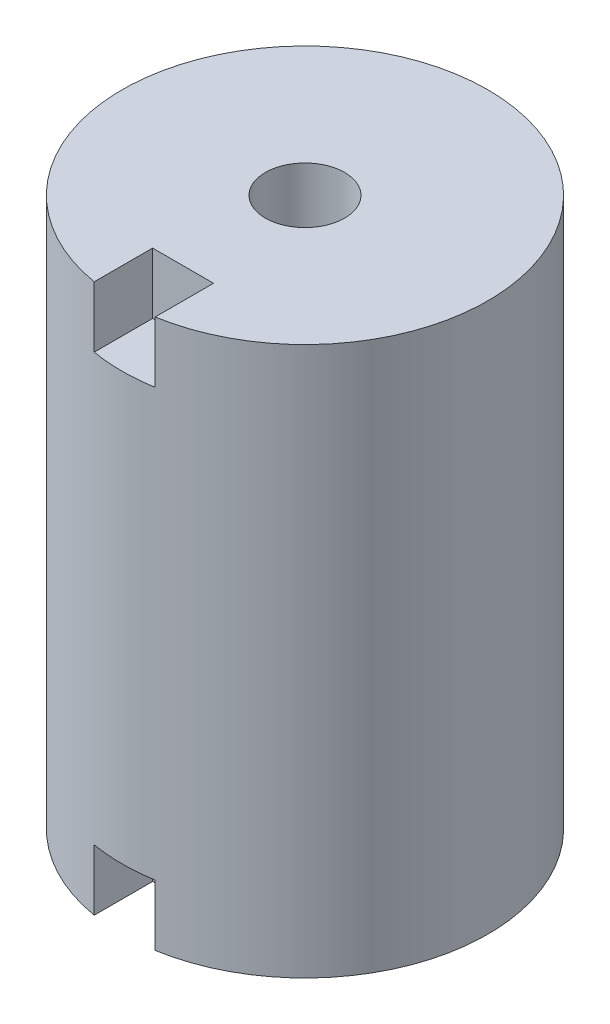
ISO-10303-21;
HEADER;
FILE_DESCRIPTION(('STEP AP214'),'2;1');
FILE_NAME('part.step','',(''),(''),'','','');
FILE_SCHEMA(('AUTOMOTIVE_DESIGN { 1 0 10303 214 1 1 1 1 }'));
ENDSEC;
DATA;
#1=APPLICATION_CONTEXT('core data for automotive mechanical design processes');
#2=APPLICATION_PROTOCOL_DEFINITION('international standard','automotive_design',2000,#1);
#3=PRODUCT_CONTEXT('',#1,'mechanical');
#4=PRODUCT('Part','Part','',(#3));
#5=PRODUCT_RELATED_PRODUCT_CATEGORY('part','',(#4));
#6=PRODUCT_DEFINITION_FORMATION('','',#4);
#7=PRODUCT_DEFINITION_CONTEXT('part definition',#1,'design');
#8=PRODUCT_DEFINITION('design','',#6,#7);
#9=PRODUCT_DEFINITION_SHAPE('','',#8);
#10=(LENGTH_UNIT() NAMED_UNIT(*) SI_UNIT(.MILLI.,.METRE.));
#11=(NAMED_UNIT(*) PLANE_ANGLE_UNIT() SI_UNIT($,.RADIAN.));
#12=(NAMED_UNIT(*) SI_UNIT($,.STERADIAN.) SOLID_ANGLE_UNIT());
#13=UNCERTAINTY_MEASURE_WITH_UNIT(LENGTH_MEASURE(1.E-05),#10,'distance_accuracy_value','');
#14=(GEOMETRIC_REPRESENTATION_CONTEXT(3) GLOBAL_UNCERTAINTY_ASSIGNED_CONTEXT((#13)) GLOBAL_UNIT_ASSIGNED_CONTEXT((#10,
#11,#12)) REPRESENTATION_CONTEXT('',''));
#15=CARTESIAN_POINT('',(0.,0.,0.));
#16=DIRECTION('',(0.,0.,1.));
#17=DIRECTION('',(1.,0.,0.));
#18=AXIS2_PLACEMENT_3D('',#15,#16,#17);
#19=CARTESIAN_POINT('',(0.,-9.,0.));
#20=DIRECTION('',(0.,1.,0.));
#21=DIRECTION('',(0.,0.,1.));
#22=AXIS2_PLACEMENT_3D('',#19,#20,#21);
#23=PLANE('',#22);
#24=DIRECTION('',(-1.,0.,0.));
#25=VECTOR('',#24,1.);
#26=CARTESIAN_POINT('',(-3.10523751104485,-9.,2.6));
#27=LINE('',#26,#25);
#28=CARTESIAN_POINT('',(3.10523751104485,-9.,2.6));
#29=VERTEX_POINT('',#28);
#30=CARTESIAN_POINT('',(-3.10523751104485,-9.,2.6));
#31=VERTEX_POINT('',#30);
#32=EDGE_CURVE('E190',#29,#31,#27,.T.);
#33=ORIENTED_EDGE('',*,*,#32,.F.);
#34=CARTESIAN_POINT('',(0.,-9.,0.));
#35=DIRECTION('',(0.,-1.,0.));
#36=DIRECTION('',(0.,0.,-1.));
#37=AXIS2_PLACEMENT_3D('',#34,#35,#36);
#38=CIRCLE('',#37,4.05);
#39=EDGE_CURVE('E181',#31,#29,#38,.T.);
#40=ORIENTED_EDGE('',*,*,#39,.F.);
#41=EDGE_LOOP('',(#33,#40));
#42=FACE_BOUND('',#41,.T.);
#43=DIRECTION('',(0.,0.,-1.));
#44=VECTOR('',#43,1.);
#45=CARTESIAN_POINT('',(1.,-9.,7.));
#46=LINE('',#45,#44);
#47=CARTESIAN_POINT('',(1.,-9.,5.91607978309962));
#48=VERTEX_POINT('',#47);
#49=CARTESIAN_POINT('',(1.,-9.,4.));
#50=VERTEX_POINT('',#49);
#51=EDGE_CURVE('E144',#48,#50,#46,.T.);
#52=ORIENTED_EDGE('',*,*,#51,.T.);
#53=DIRECTION('',(-1.,0.,0.));
#54=VECTOR('',#53,1.);
#55=CARTESIAN_POINT('',(-1.,-9.,4.));
#56=LINE('',#55,#54);
#57=CARTESIAN_POINT('',(-1.,-9.,4.));
#58=VERTEX_POINT('',#57);
#59=EDGE_CURVE('E148',#50,#58,#56,.T.);
#60=ORIENTED_EDGE('',*,*,#59,.T.);
#61=DIRECTION('',(0.,0.,1.));
#62=VECTOR('',#61,1.);
#63=CARTESIAN_POINT('',(-1.,-9.,7.));
#64=LINE('',#63,#62);
#65=CARTESIAN_POINT('',(-1.,-9.,5.91607978309962));
#66=VERTEX_POINT('',#65);
#67=EDGE_CURVE('E136',#58,#66,#64,.T.);
#68=ORIENTED_EDGE('',*,*,#67,.T.);
#69=CARTESIAN_POINT('',(0.,-9.,0.));
#70=DIRECTION('',(0.,1.,0.));
#71=DIRECTION('',(0.,0.,1.));
#72=AXIS2_PLACEMENT_3D('',#69,#70,#71);
#73=CIRCLE('',#72,6.);
#74=EDGE_CURVE('E211',#48,#66,#73,.T.);
#75=ORIENTED_EDGE('',*,*,#74,.F.);
#76=EDGE_LOOP('',(#52,#60,#68,#75));
#77=FACE_BOUND('',#76,.T.);
#78=ADVANCED_FACE('F43',(#42,#77),#23,.F.);
#79=CARTESIAN_POINT('',(0.,9.,0.));
#80=DIRECTION('',(0.,-1.,0.));
#81=DIRECTION('',(0.,0.,-1.));
#82=AXIS2_PLACEMENT_3D('',#79,#80,#81);
#83=CYLINDRICAL_SURFACE('',#82,6.);
#84=CARTESIAN_POINT('',(0.,7.,0.));
#85=DIRECTION('',(0.,1.,0.));
#86=DIRECTION('',(0.,0.,1.));
#87=AXIS2_PLACEMENT_3D('',#84,#85,#86);
#88=CIRCLE('',#87,6.);
#89=CARTESIAN_POINT('',(-1.,7.,5.91607978309962));
#90=VERTEX_POINT('',#89);
#91=CARTESIAN_POINT('',(1.,7.,5.91607978309962));
#92=VERTEX_POINT('',#91);
#93=EDGE_CURVE('E216',#90,#92,#88,.T.);
#94=ORIENTED_EDGE('',*,*,#93,.F.);
#95=DIRECTION('',(0.,-1.,0.));
#96=VECTOR('',#95,1.);
#97=CARTESIAN_POINT('',(-1.,9.,5.91607978309962));
#98=LINE('',#97,#96);
#99=CARTESIAN_POINT('',(-1.,9.,5.91607978309962));
#100=VERTEX_POINT('',#99);
#101=EDGE_CURVE('E229',#90,#100,#98,.F.);
#102=ORIENTED_EDGE('',*,*,#101,.T.);
#103=CARTESIAN_POINT('',(0.,9.,0.));
#104=DIRECTION('',(0.,1.,0.));
#105=DIRECTION('',(0.,0.,1.));
#106=AXIS2_PLACEMENT_3D('',#103,#104,#105);
#107=CIRCLE('',#106,6.);
#108=CARTESIAN_POINT('',(1.,9.,5.91607978309962));
#109=VERTEX_POINT('',#108);
#110=EDGE_CURVE('E212',#109,#100,#107,.T.);
#111=ORIENTED_EDGE('',*,*,#110,.F.);
#112=DIRECTION('',(0.,-1.,0.));
#113=VECTOR('',#112,1.);
#114=CARTESIAN_POINT('',(1.,9.,5.91607978309962));
#115=LINE('',#114,#113);
#116=EDGE_CURVE('E225',#109,#92,#115,.T.);
#117=ORIENTED_EDGE('',*,*,#116,.T.);
#118=EDGE_LOOP('',(#94,#102,#111,#117));
#119=FACE_BOUND('',#118,.T.);
#120=DIRECTION('',(0.,-1.,0.));
#121=VECTOR('',#120,1.);
#122=CARTESIAN_POINT('',(1.,9.,5.91607978309962));
#123=LINE('',#122,#121);
#124=CARTESIAN_POINT('',(1.,-7.,5.91607978309962));
#125=VERTEX_POINT('',#124);
#126=EDGE_CURVE('E11',#48,#125,#123,.F.);
#127=ORIENTED_EDGE('',*,*,#126,.F.);
#128=ORIENTED_EDGE('',*,*,#74,.T.);
#129=DIRECTION('',(0.,-1.,0.));
#130=VECTOR('',#129,1.);
#131=CARTESIAN_POINT('',(-1.,9.,5.91607978309962));
#132=LINE('',#131,#130);
#133=CARTESIAN_POINT('',(-1.,-7.,5.91607978309962));
#134=VERTEX_POINT('',#133);
#135=EDGE_CURVE('E52',#134,#66,#132,.T.);
#136=ORIENTED_EDGE('',*,*,#135,.F.);
#137=CARTESIAN_POINT('',(0.,-7.,0.));
#138=DIRECTION('',(0.,-1.,0.));
#139=DIRECTION('',(0.,0.,-1.));
#140=AXIS2_PLACEMENT_3D('',#137,#138,#139);
#141=CIRCLE('',#140,6.);
#142=EDGE_CURVE('E142',#125,#134,#141,.T.);
#143=ORIENTED_EDGE('',*,*,#142,.F.);
#144=EDGE_LOOP('',(#127,#128,#136,#143));
#145=FACE_BOUND('',#144,.T.);
#146=ADVANCED_FACE('F45',(#119,#145),#83,.T.);
#147=CARTESIAN_POINT('',(0.,9.,0.));
#148=DIRECTION('',(0.,-1.,0.));
#149=DIRECTION('',(0.,0.,-1.));
#150=AXIS2_PLACEMENT_3D('',#147,#148,#149);
#151=CYLINDRICAL_SURFACE('',#150,1.3);
#152=CARTESIAN_POINT('',(0.,9.,0.));
#153=DIRECTION('',(0.,1.,0.));
#154=DIRECTION('',(0.,0.,1.));
#155=AXIS2_PLACEMENT_3D('',#152,#153,#154);
#156=CIRCLE('',#155,1.3);
#157=CARTESIAN_POINT('',(0.,9.,1.3));
#158=VERTEX_POINT('',#157);
#159=EDGE_CURVE('E207',#158,#158,#156,.T.);
#160=ORIENTED_EDGE('',*,*,#159,.T.);
#161=EDGE_LOOP('',(#160));
#162=FACE_BOUND('',#161,.T.);
#163=CARTESIAN_POINT('',(0.,-3.,0.));
#164=DIRECTION('',(0.,-1.,0.));
#165=DIRECTION('',(0.,0.,-1.));
#166=AXIS2_PLACEMENT_3D('',#163,#164,#165);
#167=CIRCLE('',#166,1.3);
#168=CARTESIAN_POINT('',(0.,-3.,-1.3));
#169=VERTEX_POINT('',#168);
#170=EDGE_CURVE('E203',#169,#169,#167,.T.);
#171=ORIENTED_EDGE('',*,*,#170,.T.);
#172=EDGE_LOOP('',(#171));
#173=FACE_BOUND('',#172,.T.);
#174=ADVANCED_FACE('F259',(#162,#173),#151,.F.);
#175=CARTESIAN_POINT('',(0.,9.,0.));
#176=DIRECTION('',(0.,1.,0.));
#177=DIRECTION('',(0.,0.,1.));
#178=AXIS2_PLACEMENT_3D('',#175,#176,#177);
#179=PLANE('',#178);
#180=DIRECTION('',(0.,0.,1.));
#181=VECTOR('',#180,1.);
#182=CARTESIAN_POINT('',(-1.,9.,7.));
#183=LINE('',#182,#181);
#184=CARTESIAN_POINT('',(-1.,9.,4.));
#185=VERTEX_POINT('',#184);
#186=EDGE_CURVE('E164',#185,#100,#183,.T.);
#187=ORIENTED_EDGE('',*,*,#186,.F.);
#188=DIRECTION('',(-1.,0.,0.));
#189=VECTOR('',#188,1.);
#190=CARTESIAN_POINT('',(-1.,9.,4.));
#191=LINE('',#190,#189);
#192=CARTESIAN_POINT('',(1.,9.,4.));
#193=VERTEX_POINT('',#192);
#194=EDGE_CURVE('E172',#193,#185,#191,.T.);
#195=ORIENTED_EDGE('',*,*,#194,.F.);
#196=DIRECTION('',(0.,0.,-1.));
#197=VECTOR('',#196,1.);
#198=CARTESIAN_POINT('',(1.,9.,7.));
#199=LINE('',#198,#197);
#200=EDGE_CURVE('E158',#109,#193,#199,.T.);
#201=ORIENTED_EDGE('',*,*,#200,.F.);
#202=ORIENTED_EDGE('',*,*,#110,.T.);
#203=EDGE_LOOP('',(#187,#195,#201,#202));
#204=FACE_BOUND('',#203,.T.);
#205=ORIENTED_EDGE('',*,*,#159,.F.);
#206=EDGE_LOOP('',(#205));
#207=FACE_BOUND('',#206,.T.);
#208=ADVANCED_FACE('F263',(#204,#207),#179,.T.);
#209=CARTESIAN_POINT('',(0.,-3.,0.));
#210=DIRECTION('',(0.,-1.,0.));
#211=DIRECTION('',(0.,0.,-1.));
#212=AXIS2_PLACEMENT_3D('',#209,#210,#211);
#213=CYLINDRICAL_SURFACE('',#212,4.05);
#214=ORIENTED_EDGE('',*,*,#39,.T.);
#215=DIRECTION('',(0.,-1.,0.));
#216=VECTOR('',#215,1.);
#217=CARTESIAN_POINT('',(3.10523751104485,-3.,2.6));
#218=LINE('',#217,#216);
#219=CARTESIAN_POINT('',(3.10523751104485,-3.,2.6));
#220=VERTEX_POINT('',#219);
#221=EDGE_CURVE('E194',#220,#29,#218,.T.);
#222=ORIENTED_EDGE('',*,*,#221,.F.);
#223=CARTESIAN_POINT('',(0.,-3.,0.));
#224=DIRECTION('',(0.,-1.,0.));
#225=DIRECTION('',(0.,0.,-1.));
#226=AXIS2_PLACEMENT_3D('',#223,#224,#225);
#227=CIRCLE('',#226,4.05);
#228=CARTESIAN_POINT('',(-3.10523751104485,-3.,2.6));
#229=VERTEX_POINT('',#228);
#230=EDGE_CURVE('E185',#229,#220,#227,.T.);
#231=ORIENTED_EDGE('',*,*,#230,.F.);
#232=DIRECTION('',(0.,-1.,0.));
#233=VECTOR('',#232,1.);
#234=CARTESIAN_POINT('',(-3.10523751104485,-3.,2.6));
#235=LINE('',#234,#233);
#236=EDGE_CURVE('E200',#229,#31,#235,.T.);
#237=ORIENTED_EDGE('',*,*,#236,.T.);
#238=EDGE_LOOP('',(#214,#222,#231,#237));
#239=FACE_BOUND('',#238,.T.);
#240=ADVANCED_FACE('F266',(#239),#213,.F.);
#241=CARTESIAN_POINT('',(-3.10523751104485,-3.,2.6));
#242=DIRECTION('',(0.,0.,1.));
#243=DIRECTION('',(1.,0.,0.));
#244=AXIS2_PLACEMENT_3D('',#241,#242,#243);
#245=PLANE('',#244);
#246=ORIENTED_EDGE('',*,*,#32,.T.);
#247=ORIENTED_EDGE('',*,*,#236,.F.);
#248=DIRECTION('',(-1.,0.,0.));
#249=VECTOR('',#248,1.);
#250=CARTESIAN_POINT('',(-3.10523751104485,-3.,2.6));
#251=LINE('',#250,#249);
#252=EDGE_CURVE('E189',#220,#229,#251,.T.);
#253=ORIENTED_EDGE('',*,*,#252,.F.);
#254=ORIENTED_EDGE('',*,*,#221,.T.);
#255=EDGE_LOOP('',(#246,#247,#253,#254));
#256=FACE_BOUND('',#255,.T.);
#257=ADVANCED_FACE('F273',(#256),#245,.F.);
#258=CARTESIAN_POINT('',(0.,-3.,0.));
#259=DIRECTION('',(0.,-1.,0.));
#260=DIRECTION('',(0.,0.,-1.));
#261=AXIS2_PLACEMENT_3D('',#258,#259,#260);
#262=PLANE('',#261);
#263=ORIENTED_EDGE('',*,*,#170,.F.);
#264=EDGE_LOOP('',(#263));
#265=FACE_BOUND('',#264,.T.);
#266=ORIENTED_EDGE('',*,*,#230,.T.);
#267=ORIENTED_EDGE('',*,*,#252,.T.);
#268=EDGE_LOOP('',(#266,#267));
#269=FACE_BOUND('',#268,.T.);
#270=ADVANCED_FACE('F277',(#265,#269),#262,.T.);
#271=CARTESIAN_POINT('',(-1.,7.,7.));
#272=DIRECTION('',(-1.,0.,0.));
#273=DIRECTION('',(0.,0.,1.));
#274=AXIS2_PLACEMENT_3D('',#271,#272,#273);
#275=PLANE('',#274);
#276=DIRECTION('',(0.,0.,1.));
#277=VECTOR('',#276,1.);
#278=CARTESIAN_POINT('',(-1.,7.,7.));
#279=LINE('',#278,#277);
#280=CARTESIAN_POINT('',(-1.,7.,4.));
#281=VERTEX_POINT('',#280);
#282=EDGE_CURVE('E66',#281,#90,#279,.T.);
#283=ORIENTED_EDGE('',*,*,#282,.F.);
#284=DIRECTION('',(0.,1.,0.));
#285=VECTOR('',#284,1.);
#286=CARTESIAN_POINT('',(-1.,7.,4.));
#287=LINE('',#286,#285);
#288=EDGE_CURVE('E178',#281,#185,#287,.T.);
#289=ORIENTED_EDGE('',*,*,#288,.T.);
#290=ORIENTED_EDGE('',*,*,#186,.T.);
#291=ORIENTED_EDGE('',*,*,#101,.F.);
#292=EDGE_LOOP('',(#283,#289,#290,#291));
#293=FACE_BOUND('',#292,.T.);
#294=ADVANCED_FACE('F281',(#293),#275,.F.);
#295=CARTESIAN_POINT('',(1.,7.,7.));
#296=DIRECTION('',(1.,0.,0.));
#297=DIRECTION('',(0.,0.,-1.));
#298=AXIS2_PLACEMENT_3D('',#295,#296,#297);
#299=PLANE('',#298);
#300=ORIENTED_EDGE('',*,*,#200,.T.);
#301=DIRECTION('',(0.,1.,0.));
#302=VECTOR('',#301,1.);
#303=CARTESIAN_POINT('',(1.,7.,4.));
#304=LINE('',#303,#302);
#305=CARTESIAN_POINT('',(1.,7.,4.));
#306=VERTEX_POINT('',#305);
#307=EDGE_CURVE('E169',#306,#193,#304,.T.);
#308=ORIENTED_EDGE('',*,*,#307,.F.);
#309=DIRECTION('',(0.,0.,-1.));
#310=VECTOR('',#309,1.);
#311=CARTESIAN_POINT('',(1.,7.,7.));
#312=LINE('',#311,#310);
#313=EDGE_CURVE('E160',#92,#306,#312,.T.);
#314=ORIENTED_EDGE('',*,*,#313,.F.);
#315=ORIENTED_EDGE('',*,*,#116,.F.);
#316=EDGE_LOOP('',(#300,#308,#314,#315));
#317=FACE_BOUND('',#316,.T.);
#318=ADVANCED_FACE('F283',(#317),#299,.F.);
#319=CARTESIAN_POINT('',(0.,7.,0.));
#320=DIRECTION('',(0.,1.,0.));
#321=DIRECTION('',(0.,0.,1.));
#322=AXIS2_PLACEMENT_3D('',#319,#320,#321);
#323=PLANE('',#322);
#324=ORIENTED_EDGE('',*,*,#93,.T.);
#325=ORIENTED_EDGE('',*,*,#313,.T.);
#326=DIRECTION('',(-1.,0.,0.));
#327=VECTOR('',#326,1.);
#328=CARTESIAN_POINT('',(-1.,7.,4.));
#329=LINE('',#328,#327);
#330=EDGE_CURVE('E163',#306,#281,#329,.T.);
#331=ORIENTED_EDGE('',*,*,#330,.T.);
#332=ORIENTED_EDGE('',*,*,#282,.T.);
#333=EDGE_LOOP('',(#324,#325,#331,#332));
#334=FACE_BOUND('',#333,.T.);
#335=ADVANCED_FACE('F249',(#334),#323,.T.);
#336=CARTESIAN_POINT('',(-1.,7.,4.));
#337=DIRECTION('',(0.,0.,-1.));
#338=DIRECTION('',(-1.,0.,0.));
#339=AXIS2_PLACEMENT_3D('',#336,#337,#338);
#340=PLANE('',#339);
#341=ORIENTED_EDGE('',*,*,#194,.T.);
#342=ORIENTED_EDGE('',*,*,#288,.F.);
#343=ORIENTED_EDGE('',*,*,#330,.F.);
#344=ORIENTED_EDGE('',*,*,#307,.T.);
#345=EDGE_LOOP('',(#341,#342,#343,#344));
#346=FACE_BOUND('',#345,.T.);
#347=ADVANCED_FACE('F242',(#346),#340,.F.);
#348=CARTESIAN_POINT('',(1.,-7.,7.));
#349=DIRECTION('',(-1.,0.,0.));
#350=DIRECTION('',(0.,0.,1.));
#351=AXIS2_PLACEMENT_3D('',#348,#349,#350);
#352=PLANE('',#351);
#353=ORIENTED_EDGE('',*,*,#126,.T.);
#354=DIRECTION('',(0.,0.,-1.));
#355=VECTOR('',#354,1.);
#356=CARTESIAN_POINT('',(1.,-7.,7.));
#357=LINE('',#356,#355);
#358=CARTESIAN_POINT('',(1.,-7.,4.));
#359=VERTEX_POINT('',#358);
#360=EDGE_CURVE('E59',#125,#359,#357,.T.);
#361=ORIENTED_EDGE('',*,*,#360,.T.);
#362=DIRECTION('',(0.,-1.,0.));
#363=VECTOR('',#362,1.);
#364=CARTESIAN_POINT('',(1.,-7.,4.));
#365=LINE('',#364,#363);
#366=EDGE_CURVE('E126',#359,#50,#365,.T.);
#367=ORIENTED_EDGE('',*,*,#366,.T.);
#368=ORIENTED_EDGE('',*,*,#51,.F.);
#369=EDGE_LOOP('',(#353,#361,#367,#368));
#370=FACE_BOUND('',#369,.T.);
#371=ADVANCED_FACE('F240',(#370),#352,.T.);
#372=CARTESIAN_POINT('',(-1.,-7.,7.));
#373=DIRECTION('',(1.,0.,0.));
#374=DIRECTION('',(0.,0.,-1.));
#375=AXIS2_PLACEMENT_3D('',#372,#373,#374);
#376=PLANE('',#375);
#377=ORIENTED_EDGE('',*,*,#135,.T.);
#378=ORIENTED_EDGE('',*,*,#67,.F.);
#379=DIRECTION('',(0.,-1.,0.));
#380=VECTOR('',#379,1.);
#381=CARTESIAN_POINT('',(-1.,-7.,4.));
#382=LINE('',#381,#380);
#383=CARTESIAN_POINT('',(-1.,-7.,4.));
#384=VERTEX_POINT('',#383);
#385=EDGE_CURVE('E124',#384,#58,#382,.T.);
#386=ORIENTED_EDGE('',*,*,#385,.F.);
#387=DIRECTION('',(0.,0.,1.));
#388=VECTOR('',#387,1.);
#389=CARTESIAN_POINT('',(-1.,-7.,7.));
#390=LINE('',#389,#388);
#391=EDGE_CURVE('E129',#384,#134,#390,.T.);
#392=ORIENTED_EDGE('',*,*,#391,.T.);
#393=EDGE_LOOP('',(#377,#378,#386,#392));
#394=FACE_BOUND('',#393,.T.);
#395=ADVANCED_FACE('F133',(#394),#376,.T.);
#396=CARTESIAN_POINT('',(0.,-7.,0.));
#397=DIRECTION('',(0.,-1.,0.));
#398=DIRECTION('',(0.,0.,1.));
#399=AXIS2_PLACEMENT_3D('',#396,#397,#398);
#400=PLANE('',#399);
#401=ORIENTED_EDGE('',*,*,#142,.T.);
#402=ORIENTED_EDGE('',*,*,#391,.F.);
#403=DIRECTION('',(-1.,0.,0.));
#404=VECTOR('',#403,1.);
#405=CARTESIAN_POINT('',(-1.,-7.,4.));
#406=LINE('',#405,#404);
#407=EDGE_CURVE('E120',#359,#384,#406,.T.);
#408=ORIENTED_EDGE('',*,*,#407,.F.);
#409=ORIENTED_EDGE('',*,*,#360,.F.);
#410=EDGE_LOOP('',(#401,#402,#408,#409));
#411=FACE_BOUND('',#410,.T.);
#412=ADVANCED_FACE('F140',(#411),#400,.T.);
#413=CARTESIAN_POINT('',(-1.,-7.,4.));
#414=DIRECTION('',(0.,0.,1.));
#415=DIRECTION('',(1.,0.,0.));
#416=AXIS2_PLACEMENT_3D('',#413,#414,#415);
#417=PLANE('',#416);
#418=ORIENTED_EDGE('',*,*,#59,.F.);
#419=ORIENTED_EDGE('',*,*,#366,.F.);
#420=ORIENTED_EDGE('',*,*,#407,.T.);
#421=ORIENTED_EDGE('',*,*,#385,.T.);
#422=EDGE_LOOP('',(#418,#419,#420,#421));
#423=FACE_BOUND('',#422,.T.);
#424=ADVANCED_FACE('F123',(#423),#417,.T.);
#425=CLOSED_SHELL('',(#78,#146,#174,#208,#240,#257,#270,#294,#318,#335,#347,#371,#395,#412,#424));
#426=MANIFOLD_SOLID_BREP('B2',#425);
#427=ADVANCED_BREP_SHAPE_REPRESENTATION('',(#18,#426),#14);
#428=SHAPE_DEFINITION_REPRESENTATION(#9,#427);
ENDSEC;
END-ISO-10303-21;
